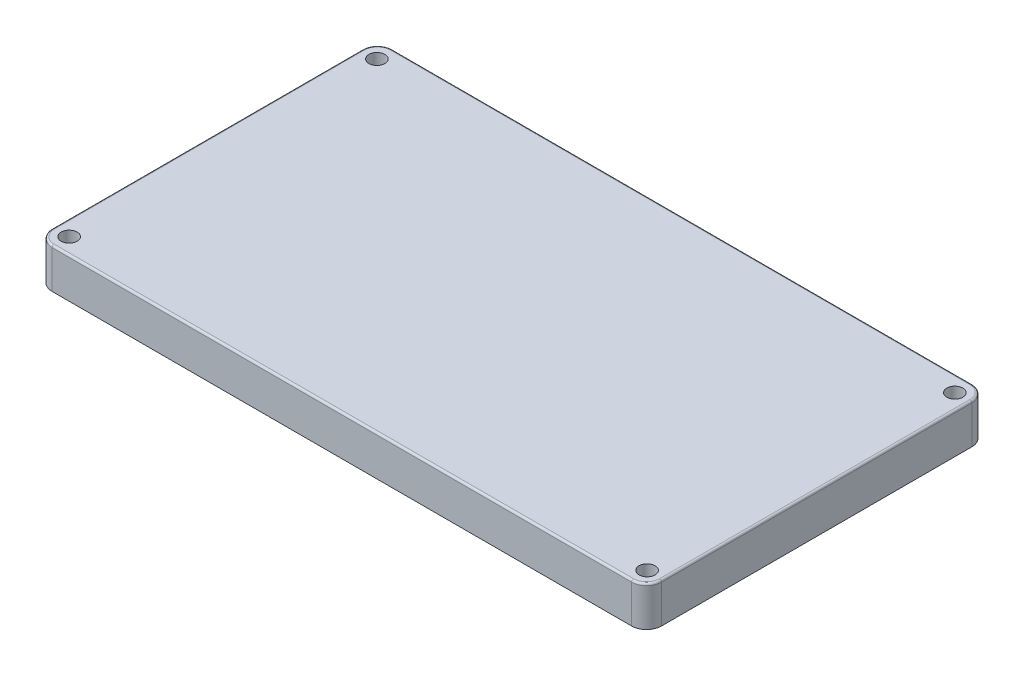
ISO-10303-21;
HEADER;
FILE_DESCRIPTION(('STEP AP214'),'2;1');
FILE_NAME('part.step','',(''),(''),'','','');
FILE_SCHEMA(('AUTOMOTIVE_DESIGN { 1 0 10303 214 1 1 1 1 }'));
ENDSEC;
DATA;
#1=APPLICATION_CONTEXT('core data for automotive mechanical design processes');
#2=APPLICATION_PROTOCOL_DEFINITION('international standard','automotive_design',2000,#1);
#3=PRODUCT_CONTEXT('',#1,'mechanical');
#4=PRODUCT('Part','Part','',(#3));
#5=PRODUCT_RELATED_PRODUCT_CATEGORY('part','',(#4));
#6=PRODUCT_DEFINITION_FORMATION('','',#4);
#7=PRODUCT_DEFINITION_CONTEXT('part definition',#1,'design');
#8=PRODUCT_DEFINITION('design','',#6,#7);
#9=PRODUCT_DEFINITION_SHAPE('','',#8);
#10=(LENGTH_UNIT() NAMED_UNIT(*) SI_UNIT(.MILLI.,.METRE.));
#11=(NAMED_UNIT(*) PLANE_ANGLE_UNIT() SI_UNIT($,.RADIAN.));
#12=(NAMED_UNIT(*) SI_UNIT($,.STERADIAN.) SOLID_ANGLE_UNIT());
#13=UNCERTAINTY_MEASURE_WITH_UNIT(LENGTH_MEASURE(1.E-05),#10,'distance_accuracy_value','');
#14=(GEOMETRIC_REPRESENTATION_CONTEXT(3) GLOBAL_UNCERTAINTY_ASSIGNED_CONTEXT((#13)) GLOBAL_UNIT_ASSIGNED_CONTEXT((#10,
#11,#12)) REPRESENTATION_CONTEXT('',''));
#15=CARTESIAN_POINT('',(0.,0.,0.));
#16=DIRECTION('',(0.,0.,1.));
#17=DIRECTION('',(1.,0.,0.));
#18=AXIS2_PLACEMENT_3D('',#15,#16,#17);
#19=CARTESIAN_POINT('',(0.,-82.5520685347959,-170.18));
#20=DIRECTION('',(-1.,0.,0.));
#21=DIRECTION('',(0.,0.,1.));
#22=AXIS2_PLACEMENT_3D('',#19,#20,#21);
#23=PLANE('',#22);
#24=DIRECTION('',(0.,1.,0.));
#25=VECTOR('',#24,1.);
#26=CARTESIAN_POINT('',(0.,-82.5520685347959,-7.50000000000001));
#27=LINE('',#26,#25);
#28=CARTESIAN_POINT('',(0.,-82.5520685347959,-7.50000000000001));
#29=VERTEX_POINT('',#28);
#30=CARTESIAN_POINT('',(0.,-63.5520685347959,-7.50000000000001));
#31=VERTEX_POINT('',#30);
#32=EDGE_CURVE('E174',#29,#31,#27,.T.);
#33=ORIENTED_EDGE('',*,*,#32,.T.);
#34=DIRECTION('',(0.,0.,1.));
#35=VECTOR('',#34,1.);
#36=CARTESIAN_POINT('',(0.,-63.5520685347959,-170.18));
#37=LINE('',#36,#35);
#38=CARTESIAN_POINT('',(0.,-63.5520685347959,-162.68));
#39=VERTEX_POINT('',#38);
#40=EDGE_CURVE('E210',#31,#39,#37,.F.);
#41=ORIENTED_EDGE('',*,*,#40,.T.);
#42=DIRECTION('',(0.,1.,0.));
#43=VECTOR('',#42,1.);
#44=CARTESIAN_POINT('',(0.,-82.5520685347959,-162.68));
#45=LINE('',#44,#43);
#46=CARTESIAN_POINT('',(0.,-82.5520685347959,-162.68));
#47=VERTEX_POINT('',#46);
#48=EDGE_CURVE('E178',#39,#47,#45,.F.);
#49=ORIENTED_EDGE('',*,*,#48,.T.);
#50=DIRECTION('',(0.,0.,1.));
#51=VECTOR('',#50,1.);
#52=CARTESIAN_POINT('',(0.,-82.5520685347959,-170.18));
#53=LINE('',#52,#51);
#54=EDGE_CURVE('E295',#47,#29,#53,.T.);
#55=ORIENTED_EDGE('',*,*,#54,.T.);
#56=EDGE_LOOP('',(#33,#41,#49,#55));
#57=FACE_BOUND('',#56,.T.);
#58=ADVANCED_FACE('F47',(#57),#23,.T.);
#59=CARTESIAN_POINT('',(304.8,-82.5520685347959,-170.18));
#60=DIRECTION('',(0.,0.,-1.));
#61=DIRECTION('',(-1.,0.,0.));
#62=AXIS2_PLACEMENT_3D('',#59,#60,#61);
#63=PLANE('',#62);
#64=DIRECTION('',(0.,1.,0.));
#65=VECTOR('',#64,1.);
#66=CARTESIAN_POINT('',(7.50000000000001,-82.5520685347959,-170.18));
#67=LINE('',#66,#65);
#68=CARTESIAN_POINT('',(7.50000000000012,-82.5520685347959,-170.18));
#69=VERTEX_POINT('',#68);
#70=CARTESIAN_POINT('',(7.50000000000001,-63.5520685347959,-170.18));
#71=VERTEX_POINT('',#70);
#72=EDGE_CURVE('E306',#69,#71,#67,.T.);
#73=ORIENTED_EDGE('',*,*,#72,.T.);
#74=DIRECTION('',(-1.,0.,0.));
#75=VECTOR('',#74,1.);
#76=CARTESIAN_POINT('',(304.8,-63.5520685347959,-170.18));
#77=LINE('',#76,#75);
#78=CARTESIAN_POINT('',(297.3,-63.5520685347959,-170.18));
#79=VERTEX_POINT('',#78);
#80=EDGE_CURVE('E213',#71,#79,#77,.F.);
#81=ORIENTED_EDGE('',*,*,#80,.T.);
#82=DIRECTION('',(0.,1.,0.));
#83=VECTOR('',#82,1.);
#84=CARTESIAN_POINT('',(297.3,-82.5520685347959,-170.18));
#85=LINE('',#84,#83);
#86=CARTESIAN_POINT('',(297.3,-82.5520685347959,-170.18));
#87=VERTEX_POINT('',#86);
#88=EDGE_CURVE('E310',#79,#87,#85,.F.);
#89=ORIENTED_EDGE('',*,*,#88,.T.);
#90=DIRECTION('',(-1.,0.,0.));
#91=VECTOR('',#90,1.);
#92=CARTESIAN_POINT('',(304.8,-82.5520685347959,-170.18));
#93=LINE('',#92,#91);
#94=EDGE_CURVE('E144',#87,#69,#93,.T.);
#95=ORIENTED_EDGE('',*,*,#94,.T.);
#96=EDGE_LOOP('',(#73,#81,#89,#95));
#97=FACE_BOUND('',#96,.T.);
#98=ADVANCED_FACE('F348',(#97),#63,.T.);
#99=CARTESIAN_POINT('',(304.8,-82.5520685347959,0.));
#100=DIRECTION('',(1.,0.,0.));
#101=DIRECTION('',(0.,0.,-1.));
#102=AXIS2_PLACEMENT_3D('',#99,#100,#101);
#103=PLANE('',#102);
#104=DIRECTION('',(0.,1.,0.));
#105=VECTOR('',#104,1.);
#106=CARTESIAN_POINT('',(304.8,-82.5520685347959,-162.68));
#107=LINE('',#106,#105);
#108=CARTESIAN_POINT('',(304.8,-82.5520685347959,-162.68));
#109=VERTEX_POINT('',#108);
#110=CARTESIAN_POINT('',(304.8,-63.5520685347959,-162.68));
#111=VERTEX_POINT('',#110);
#112=EDGE_CURVE('E143',#109,#111,#107,.T.);
#113=ORIENTED_EDGE('',*,*,#112,.T.);
#114=DIRECTION('',(0.,0.,-1.));
#115=VECTOR('',#114,1.);
#116=CARTESIAN_POINT('',(304.8,-63.5520685347959,0.));
#117=LINE('',#116,#115);
#118=CARTESIAN_POINT('',(304.8,-63.5520685347959,-7.5));
#119=VERTEX_POINT('',#118);
#120=EDGE_CURVE('E57',#111,#119,#117,.F.);
#121=ORIENTED_EDGE('',*,*,#120,.T.);
#122=DIRECTION('',(0.,1.,0.));
#123=VECTOR('',#122,1.);
#124=CARTESIAN_POINT('',(304.8,-82.5520685347959,-7.5));
#125=LINE('',#124,#123);
#126=CARTESIAN_POINT('',(304.8,-82.5520685347959,-7.5));
#127=VERTEX_POINT('',#126);
#128=EDGE_CURVE('E136',#119,#127,#125,.F.);
#129=ORIENTED_EDGE('',*,*,#128,.T.);
#130=DIRECTION('',(0.,0.,-1.));
#131=VECTOR('',#130,1.);
#132=CARTESIAN_POINT('',(304.8,-82.5520685347959,0.));
#133=LINE('',#132,#131);
#134=EDGE_CURVE('E139',#127,#109,#133,.T.);
#135=ORIENTED_EDGE('',*,*,#134,.T.);
#136=EDGE_LOOP('',(#113,#121,#129,#135));
#137=FACE_BOUND('',#136,.T.);
#138=ADVANCED_FACE('F138',(#137),#103,.T.);
#139=CARTESIAN_POINT('',(0.,-82.5520685347959,0.));
#140=DIRECTION('',(0.,0.,1.));
#141=DIRECTION('',(1.,0.,0.));
#142=AXIS2_PLACEMENT_3D('',#139,#140,#141);
#143=PLANE('',#142);
#144=DIRECTION('',(0.,1.,0.));
#145=VECTOR('',#144,1.);
#146=CARTESIAN_POINT('',(297.3,-82.5520685347959,0.));
#147=LINE('',#146,#145);
#148=CARTESIAN_POINT('',(297.3,-82.5520685347959,0.));
#149=VERTEX_POINT('',#148);
#150=CARTESIAN_POINT('',(297.3,-63.5520685347959,0.));
#151=VERTEX_POINT('',#150);
#152=EDGE_CURVE('E158',#149,#151,#147,.T.);
#153=ORIENTED_EDGE('',*,*,#152,.T.);
#154=DIRECTION('',(1.,0.,0.));
#155=VECTOR('',#154,1.);
#156=CARTESIAN_POINT('',(0.,-63.5520685347959,0.));
#157=LINE('',#156,#155);
#158=CARTESIAN_POINT('',(7.5,-63.5520685347959,0.));
#159=VERTEX_POINT('',#158);
#160=EDGE_CURVE('E222',#151,#159,#157,.F.);
#161=ORIENTED_EDGE('',*,*,#160,.T.);
#162=DIRECTION('',(0.,1.,0.));
#163=VECTOR('',#162,1.);
#164=CARTESIAN_POINT('',(7.5,-82.5520685347959,0.));
#165=LINE('',#164,#163);
#166=CARTESIAN_POINT('',(7.5,-82.5520685347959,0.));
#167=VERTEX_POINT('',#166);
#168=EDGE_CURVE('E164',#159,#167,#165,.F.);
#169=ORIENTED_EDGE('',*,*,#168,.T.);
#170=DIRECTION('',(1.,0.,0.));
#171=VECTOR('',#170,1.);
#172=CARTESIAN_POINT('',(0.,-82.5520685347959,0.));
#173=LINE('',#172,#171);
#174=EDGE_CURVE('E155',#167,#149,#173,.T.);
#175=ORIENTED_EDGE('',*,*,#174,.T.);
#176=EDGE_LOOP('',(#153,#161,#169,#175));
#177=FACE_BOUND('',#176,.T.);
#178=ADVANCED_FACE('F364',(#177),#143,.T.);
#179=CARTESIAN_POINT('',(0.,-82.5520685347959,0.));
#180=DIRECTION('',(0.,1.,0.));
#181=DIRECTION('',(0.,0.,1.));
#182=AXIS2_PLACEMENT_3D('',#179,#180,#181);
#183=PLANE('',#182);
#184=CARTESIAN_POINT('',(7.99999999999998,-82.5520685347959,-8.00000000000009));
#185=DIRECTION('',(0.,1.,0.));
#186=DIRECTION('',(0.,0.,1.));
#187=AXIS2_PLACEMENT_3D('',#184,#185,#186);
#188=CIRCLE('',#187,4.00000000000001);
#189=CARTESIAN_POINT('',(7.99999999999998,-82.5520685347959,-4.00000000000008));
#190=VERTEX_POINT('',#189);
#191=EDGE_CURVE('E263',#190,#190,#188,.T.);
#192=ORIENTED_EDGE('',*,*,#191,.T.);
#193=EDGE_LOOP('',(#192));
#194=FACE_BOUND('',#193,.T.);
#195=CARTESIAN_POINT('',(297.052,-82.5520685347959,-8.00000000000009));
#196=DIRECTION('',(0.,1.,0.));
#197=DIRECTION('',(0.,0.,1.));
#198=AXIS2_PLACEMENT_3D('',#195,#196,#197);
#199=CIRCLE('',#198,4.);
#200=CARTESIAN_POINT('',(297.052,-82.5520685347959,-4.00000000000009));
#201=VERTEX_POINT('',#200);
#202=EDGE_CURVE('E275',#201,#201,#199,.T.);
#203=ORIENTED_EDGE('',*,*,#202,.T.);
#204=EDGE_LOOP('',(#203));
#205=FACE_BOUND('',#204,.T.);
#206=CARTESIAN_POINT('',(7.99999999999998,-82.5520685347959,-161.924));
#207=DIRECTION('',(0.,1.,0.));
#208=DIRECTION('',(0.,0.,1.));
#209=AXIS2_PLACEMENT_3D('',#206,#207,#208);
#210=CIRCLE('',#209,4.00000000000001);
#211=CARTESIAN_POINT('',(7.99999999999998,-82.5520685347959,-157.924));
#212=VERTEX_POINT('',#211);
#213=EDGE_CURVE('E283',#212,#212,#210,.T.);
#214=ORIENTED_EDGE('',*,*,#213,.T.);
#215=EDGE_LOOP('',(#214));
#216=FACE_BOUND('',#215,.T.);
#217=CARTESIAN_POINT('',(297.052,-82.5520685347959,-161.924));
#218=DIRECTION('',(0.,1.,0.));
#219=DIRECTION('',(0.,0.,1.));
#220=AXIS2_PLACEMENT_3D('',#217,#218,#219);
#221=CIRCLE('',#220,4.);
#222=CARTESIAN_POINT('',(297.052,-82.5520685347959,-157.924));
#223=VERTEX_POINT('',#222);
#224=EDGE_CURVE('E291',#223,#223,#221,.T.);
#225=ORIENTED_EDGE('',*,*,#224,.T.);
#226=EDGE_LOOP('',(#225));
#227=FACE_BOUND('',#226,.T.);
#228=ORIENTED_EDGE('',*,*,#94,.F.);
#229=CARTESIAN_POINT('',(297.3,-82.5520685347959,-162.68));
#230=DIRECTION('',(0.,1.,0.));
#231=DIRECTION('',(0.,0.,1.));
#232=AXIS2_PLACEMENT_3D('',#229,#230,#231);
#233=CIRCLE('',#232,7.5);
#234=EDGE_CURVE('E153',#87,#109,#233,.F.);
#235=ORIENTED_EDGE('',*,*,#234,.T.);
#236=ORIENTED_EDGE('',*,*,#134,.F.);
#237=CARTESIAN_POINT('',(297.3,-82.5520685347959,-7.5));
#238=DIRECTION('',(0.,1.,0.));
#239=DIRECTION('',(0.,0.,1.));
#240=AXIS2_PLACEMENT_3D('',#237,#238,#239);
#241=CIRCLE('',#240,7.5);
#242=EDGE_CURVE('E150',#127,#149,#241,.F.);
#243=ORIENTED_EDGE('',*,*,#242,.T.);
#244=ORIENTED_EDGE('',*,*,#174,.F.);
#245=CARTESIAN_POINT('',(7.5,-82.5520685347959,-7.50000000000001));
#246=DIRECTION('',(0.,1.,0.));
#247=DIRECTION('',(0.,0.,1.));
#248=AXIS2_PLACEMENT_3D('',#245,#246,#247);
#249=CIRCLE('',#248,7.5);
#250=EDGE_CURVE('E166',#167,#29,#249,.F.);
#251=ORIENTED_EDGE('',*,*,#250,.T.);
#252=ORIENTED_EDGE('',*,*,#54,.F.);
#253=CARTESIAN_POINT('',(7.50000000000001,-82.5520685347959,-162.68));
#254=DIRECTION('',(0.,1.,0.));
#255=DIRECTION('',(0.,0.,1.));
#256=AXIS2_PLACEMENT_3D('',#253,#254,#255);
#257=CIRCLE('',#256,7.5);
#258=EDGE_CURVE('E160',#47,#69,#257,.F.);
#259=ORIENTED_EDGE('',*,*,#258,.T.);
#260=EDGE_LOOP('',(#228,#235,#236,#243,#244,#251,#252,#259));
#261=FACE_BOUND('',#260,.T.);
#262=ADVANCED_FACE('F148',(#194,#205,#216,#227,#261),#183,.F.);
#263=CARTESIAN_POINT('',(0.,-62.5520685347959,0.));
#264=DIRECTION('',(0.,1.,0.));
#265=DIRECTION('',(0.,0.,1.));
#266=AXIS2_PLACEMENT_3D('',#263,#264,#265);
#267=PLANE('',#266);
#268=DIRECTION('',(-1.,0.,0.));
#269=VECTOR('',#268,1.);
#270=CARTESIAN_POINT('',(0.,-62.5520685347959,-169.18));
#271=LINE('',#270,#269);
#272=CARTESIAN_POINT('',(297.3,-62.5520685347959,-169.18));
#273=VERTEX_POINT('',#272);
#274=CARTESIAN_POINT('',(7.50000000000001,-62.5520685347959,-169.18));
#275=VERTEX_POINT('',#274);
#276=EDGE_CURVE('E196',#273,#275,#271,.T.);
#277=ORIENTED_EDGE('',*,*,#276,.T.);
#278=CARTESIAN_POINT('',(7.50000000000001,-62.5520685347959,-162.68));
#279=DIRECTION('',(0.,1.,0.));
#280=DIRECTION('',(0.,0.,1.));
#281=AXIS2_PLACEMENT_3D('',#278,#279,#280);
#282=CIRCLE('',#281,6.5);
#283=CARTESIAN_POINT('',(0.999999999999999,-62.5520685347959,-162.68));
#284=VERTEX_POINT('',#283);
#285=EDGE_CURVE('E202',#275,#284,#282,.T.);
#286=ORIENTED_EDGE('',*,*,#285,.T.);
#287=DIRECTION('',(0.,0.,1.));
#288=VECTOR('',#287,1.);
#289=CARTESIAN_POINT('',(0.999999999999999,-62.5520685347959,0.));
#290=LINE('',#289,#288);
#291=CARTESIAN_POINT('',(0.999999999999999,-62.5520685347959,-7.50000000000001));
#292=VERTEX_POINT('',#291);
#293=EDGE_CURVE('E199',#284,#292,#290,.T.);
#294=ORIENTED_EDGE('',*,*,#293,.T.);
#295=CARTESIAN_POINT('',(7.5,-62.5520685347959,-7.50000000000001));
#296=DIRECTION('',(0.,1.,0.));
#297=DIRECTION('',(0.,0.,1.));
#298=AXIS2_PLACEMENT_3D('',#295,#296,#297);
#299=CIRCLE('',#298,6.5);
#300=CARTESIAN_POINT('',(7.5,-62.5520685347959,-0.999999999999999));
#301=VERTEX_POINT('',#300);
#302=EDGE_CURVE('E193',#292,#301,#299,.T.);
#303=ORIENTED_EDGE('',*,*,#302,.T.);
#304=DIRECTION('',(1.,0.,0.));
#305=VECTOR('',#304,1.);
#306=CARTESIAN_POINT('',(0.,-62.5520685347959,-0.999999999999999));
#307=LINE('',#306,#305);
#308=CARTESIAN_POINT('',(297.3,-62.5520685347959,-0.999999999999999));
#309=VERTEX_POINT('',#308);
#310=EDGE_CURVE('E187',#301,#309,#307,.T.);
#311=ORIENTED_EDGE('',*,*,#310,.T.);
#312=CARTESIAN_POINT('',(297.3,-62.5520685347959,-7.5));
#313=DIRECTION('',(0.,1.,0.));
#314=DIRECTION('',(0.,0.,1.));
#315=AXIS2_PLACEMENT_3D('',#312,#313,#314);
#316=CIRCLE('',#315,6.5);
#317=CARTESIAN_POINT('',(303.8,-62.5520685347959,-7.5));
#318=VERTEX_POINT('',#317);
#319=EDGE_CURVE('E181',#309,#318,#316,.T.);
#320=ORIENTED_EDGE('',*,*,#319,.T.);
#321=DIRECTION('',(0.,0.,-1.));
#322=VECTOR('',#321,1.);
#323=CARTESIAN_POINT('',(303.8,-62.5520685347959,0.));
#324=LINE('',#323,#322);
#325=CARTESIAN_POINT('',(303.8,-62.5520685347959,-162.68));
#326=VERTEX_POINT('',#325);
#327=EDGE_CURVE('E184',#318,#326,#324,.T.);
#328=ORIENTED_EDGE('',*,*,#327,.T.);
#329=CARTESIAN_POINT('',(297.3,-62.5520685347959,-162.68));
#330=DIRECTION('',(0.,1.,0.));
#331=DIRECTION('',(0.,0.,1.));
#332=AXIS2_PLACEMENT_3D('',#329,#330,#331);
#333=CIRCLE('',#332,6.5);
#334=EDGE_CURVE('E190',#326,#273,#333,.T.);
#335=ORIENTED_EDGE('',*,*,#334,.T.);
#336=EDGE_LOOP('',(#277,#286,#294,#303,#311,#320,#328,#335));
#337=FACE_BOUND('',#336,.T.);
#338=CARTESIAN_POINT('',(7.99999999999998,-62.5520685347959,-8.00000000000009));
#339=DIRECTION('',(0.,1.,0.));
#340=DIRECTION('',(0.,0.,1.));
#341=AXIS2_PLACEMENT_3D('',#338,#339,#340);
#342=CIRCLE('',#341,4.00000000000001);
#343=CARTESIAN_POINT('',(7.99999999999998,-62.5520685347959,-4.00000000000008));
#344=VERTEX_POINT('',#343);
#345=EDGE_CURVE('E257',#344,#344,#342,.T.);
#346=ORIENTED_EDGE('',*,*,#345,.F.);
#347=EDGE_LOOP('',(#346));
#348=FACE_BOUND('',#347,.T.);
#349=CARTESIAN_POINT('',(297.052,-62.5520685347959,-8.00000000000009));
#350=DIRECTION('',(0.,1.,0.));
#351=DIRECTION('',(0.,0.,1.));
#352=AXIS2_PLACEMENT_3D('',#349,#350,#351);
#353=CIRCLE('',#352,4.);
#354=CARTESIAN_POINT('',(297.052,-62.5520685347959,-4.00000000000009));
#355=VERTEX_POINT('',#354);
#356=EDGE_CURVE('E269',#355,#355,#353,.T.);
#357=ORIENTED_EDGE('',*,*,#356,.F.);
#358=EDGE_LOOP('',(#357));
#359=FACE_BOUND('',#358,.T.);
#360=CARTESIAN_POINT('',(7.99999999999998,-62.5520685347959,-161.924));
#361=DIRECTION('',(0.,1.,0.));
#362=DIRECTION('',(0.,0.,1.));
#363=AXIS2_PLACEMENT_3D('',#360,#361,#362);
#364=CIRCLE('',#363,4.00000000000001);
#365=CARTESIAN_POINT('',(7.99999999999998,-62.5520685347959,-157.924));
#366=VERTEX_POINT('',#365);
#367=EDGE_CURVE('E279',#366,#366,#364,.T.);
#368=ORIENTED_EDGE('',*,*,#367,.F.);
#369=EDGE_LOOP('',(#368));
#370=FACE_BOUND('',#369,.T.);
#371=CARTESIAN_POINT('',(297.052,-62.5520685347959,-161.924));
#372=DIRECTION('',(0.,1.,0.));
#373=DIRECTION('',(0.,0.,1.));
#374=AXIS2_PLACEMENT_3D('',#371,#372,#373);
#375=CIRCLE('',#374,4.);
#376=CARTESIAN_POINT('',(297.052,-62.5520685347959,-157.924));
#377=VERTEX_POINT('',#376);
#378=EDGE_CURVE('E287',#377,#377,#375,.T.);
#379=ORIENTED_EDGE('',*,*,#378,.F.);
#380=EDGE_LOOP('',(#379));
#381=FACE_BOUND('',#380,.T.);
#382=ADVANCED_FACE('F358',(#337,#348,#359,#370,#381),#267,.T.);
#383=CARTESIAN_POINT('',(297.052,-62.5520685347959,-161.924));
#384=DIRECTION('',(0.,1.,0.));
#385=DIRECTION('',(0.,0.,1.));
#386=AXIS2_PLACEMENT_3D('',#383,#384,#385);
#387=CYLINDRICAL_SURFACE('',#386,4.);
#388=ORIENTED_EDGE('',*,*,#224,.F.);
#389=EDGE_LOOP('',(#388));
#390=FACE_BOUND('',#389,.T.);
#391=ORIENTED_EDGE('',*,*,#378,.T.);
#392=EDGE_LOOP('',(#391));
#393=FACE_BOUND('',#392,.T.);
#394=ADVANCED_FACE('F448',(#390,#393),#387,.F.);
#395=CARTESIAN_POINT('',(7.99999999999998,-62.5520685347959,-161.924));
#396=DIRECTION('',(0.,1.,0.));
#397=DIRECTION('',(0.,0.,1.));
#398=AXIS2_PLACEMENT_3D('',#395,#396,#397);
#399=CYLINDRICAL_SURFACE('',#398,4.00000000000001);
#400=ORIENTED_EDGE('',*,*,#213,.F.);
#401=EDGE_LOOP('',(#400));
#402=FACE_BOUND('',#401,.T.);
#403=ORIENTED_EDGE('',*,*,#367,.T.);
#404=EDGE_LOOP('',(#403));
#405=FACE_BOUND('',#404,.T.);
#406=ADVANCED_FACE('F440',(#402,#405),#399,.F.);
#407=CARTESIAN_POINT('',(297.052,-62.5520685347959,-8.00000000000009));
#408=DIRECTION('',(0.,1.,0.));
#409=DIRECTION('',(0.,0.,1.));
#410=AXIS2_PLACEMENT_3D('',#407,#408,#409);
#411=CYLINDRICAL_SURFACE('',#410,4.);
#412=ORIENTED_EDGE('',*,*,#202,.F.);
#413=EDGE_LOOP('',(#412));
#414=FACE_BOUND('',#413,.T.);
#415=ORIENTED_EDGE('',*,*,#356,.T.);
#416=EDGE_LOOP('',(#415));
#417=FACE_BOUND('',#416,.T.);
#418=ADVANCED_FACE('F431',(#414,#417),#411,.F.);
#419=CARTESIAN_POINT('',(7.99999999999998,-62.5520685347959,-8.00000000000009));
#420=DIRECTION('',(0.,1.,0.));
#421=DIRECTION('',(0.,0.,1.));
#422=AXIS2_PLACEMENT_3D('',#419,#420,#421);
#423=CYLINDRICAL_SURFACE('',#422,4.00000000000001);
#424=ORIENTED_EDGE('',*,*,#191,.F.);
#425=EDGE_LOOP('',(#424));
#426=FACE_BOUND('',#425,.T.);
#427=ORIENTED_EDGE('',*,*,#345,.T.);
#428=EDGE_LOOP('',(#427));
#429=FACE_BOUND('',#428,.T.);
#430=ADVANCED_FACE('F383',(#426,#429),#423,.F.);
#431=CARTESIAN_POINT('',(297.3,-82.5520685347959,-162.68));
#432=DIRECTION('',(0.,1.,0.));
#433=DIRECTION('',(0.,0.,1.));
#434=AXIS2_PLACEMENT_3D('',#431,#432,#433);
#435=CYLINDRICAL_SURFACE('',#434,7.5);
#436=ORIENTED_EDGE('',*,*,#88,.F.);
#437=CARTESIAN_POINT('',(297.3,-63.5520685347959,-162.68));
#438=DIRECTION('',(0.,1.,0.));
#439=DIRECTION('',(0.,0.,1.));
#440=AXIS2_PLACEMENT_3D('',#437,#438,#439);
#441=CIRCLE('',#440,7.5);
#442=EDGE_CURVE('E219',#79,#111,#441,.F.);
#443=ORIENTED_EDGE('',*,*,#442,.T.);
#444=ORIENTED_EDGE('',*,*,#112,.F.);
#445=ORIENTED_EDGE('',*,*,#234,.F.);
#446=EDGE_LOOP('',(#436,#443,#444,#445));
#447=FACE_BOUND('',#446,.T.);
#448=ADVANCED_FACE('F351',(#447),#435,.T.);
#449=CARTESIAN_POINT('',(297.3,-82.5520685347959,-7.5));
#450=DIRECTION('',(0.,1.,0.));
#451=DIRECTION('',(0.,0.,1.));
#452=AXIS2_PLACEMENT_3D('',#449,#450,#451);
#453=CYLINDRICAL_SURFACE('',#452,7.5);
#454=ORIENTED_EDGE('',*,*,#128,.F.);
#455=CARTESIAN_POINT('',(297.3,-63.5520685347959,-7.5));
#456=DIRECTION('',(0.,1.,0.));
#457=DIRECTION('',(0.,0.,1.));
#458=AXIS2_PLACEMENT_3D('',#455,#456,#457);
#459=CIRCLE('',#458,7.5);
#460=EDGE_CURVE('E11',#119,#151,#459,.F.);
#461=ORIENTED_EDGE('',*,*,#460,.T.);
#462=ORIENTED_EDGE('',*,*,#152,.F.);
#463=ORIENTED_EDGE('',*,*,#242,.F.);
#464=EDGE_LOOP('',(#454,#461,#462,#463));
#465=FACE_BOUND('',#464,.T.);
#466=ADVANCED_FACE('F157',(#465),#453,.T.);
#467=CARTESIAN_POINT('',(7.50000000000001,-82.5520685347959,-162.68));
#468=DIRECTION('',(0.,1.,0.));
#469=DIRECTION('',(0.,0.,1.));
#470=AXIS2_PLACEMENT_3D('',#467,#468,#469);
#471=CYLINDRICAL_SURFACE('',#470,7.5);
#472=ORIENTED_EDGE('',*,*,#48,.F.);
#473=CARTESIAN_POINT('',(7.50000000000001,-63.5520685347959,-162.68));
#474=DIRECTION('',(0.,1.,0.));
#475=DIRECTION('',(0.,0.,1.));
#476=AXIS2_PLACEMENT_3D('',#473,#474,#475);
#477=CIRCLE('',#476,7.5);
#478=EDGE_CURVE('E206',#39,#71,#477,.F.);
#479=ORIENTED_EDGE('',*,*,#478,.T.);
#480=ORIENTED_EDGE('',*,*,#72,.F.);
#481=ORIENTED_EDGE('',*,*,#258,.F.);
#482=EDGE_LOOP('',(#472,#479,#480,#481));
#483=FACE_BOUND('',#482,.T.);
#484=ADVANCED_FACE('F335',(#483),#471,.T.);
#485=CARTESIAN_POINT('',(7.5,-82.5520685347959,-7.50000000000001));
#486=DIRECTION('',(0.,1.,0.));
#487=DIRECTION('',(0.,0.,1.));
#488=AXIS2_PLACEMENT_3D('',#485,#486,#487);
#489=CYLINDRICAL_SURFACE('',#488,7.5);
#490=ORIENTED_EDGE('',*,*,#168,.F.);
#491=CARTESIAN_POINT('',(7.5,-63.5520685347959,-7.50000000000001));
#492=DIRECTION('',(0.,1.,0.));
#493=DIRECTION('',(0.,0.,1.));
#494=AXIS2_PLACEMENT_3D('',#491,#492,#493);
#495=CIRCLE('',#494,7.5);
#496=EDGE_CURVE('E216',#159,#31,#495,.F.);
#497=ORIENTED_EDGE('',*,*,#496,.T.);
#498=ORIENTED_EDGE('',*,*,#32,.F.);
#499=ORIENTED_EDGE('',*,*,#250,.F.);
#500=EDGE_LOOP('',(#490,#497,#498,#499));
#501=FACE_BOUND('',#500,.T.);
#502=ADVANCED_FACE('F322',(#501),#489,.T.);
#503=CARTESIAN_POINT('',(297.3,-63.5520685347959,-7.5));
#504=DIRECTION('',(0.,1.,0.));
#505=DIRECTION('',(0.,0.,1.));
#506=AXIS2_PLACEMENT_3D('',#503,#504,#505);
#507=TOROIDAL_SURFACE('',#506,6.5,0.999999999999999);
#508=CARTESIAN_POINT('',(297.3,-63.5520685347959,-0.999999999999999));
#509=DIRECTION('',(-1.,0.,0.));
#510=DIRECTION('',(0.,0.,1.));
#511=AXIS2_PLACEMENT_3D('',#508,#509,#510);
#512=CIRCLE('',#511,0.999999999999999);
#513=EDGE_CURVE('E248',#151,#309,#512,.T.);
#514=ORIENTED_EDGE('',*,*,#513,.F.);
#515=ORIENTED_EDGE('',*,*,#460,.F.);
#516=CARTESIAN_POINT('',(303.8,-63.5520685347959,-7.5));
#517=DIRECTION('',(0.,0.,-1.));
#518=DIRECTION('',(-1.,0.,0.));
#519=AXIS2_PLACEMENT_3D('',#516,#517,#518);
#520=CIRCLE('',#519,0.999999999999999);
#521=EDGE_CURVE('E51',#318,#119,#520,.T.);
#522=ORIENTED_EDGE('',*,*,#521,.F.);
#523=ORIENTED_EDGE('',*,*,#319,.F.);
#524=EDGE_LOOP('',(#514,#515,#522,#523));
#525=FACE_BOUND('',#524,.T.);
#526=ADVANCED_FACE('F49',(#525),#507,.T.);
#527=CARTESIAN_POINT('',(303.8,-63.5520685347959,0.));
#528=DIRECTION('',(0.,0.,-1.));
#529=DIRECTION('',(-1.,0.,0.));
#530=AXIS2_PLACEMENT_3D('',#527,#528,#529);
#531=CYLINDRICAL_SURFACE('',#530,0.999999999999999);
#532=ORIENTED_EDGE('',*,*,#521,.T.);
#533=ORIENTED_EDGE('',*,*,#120,.F.);
#534=CARTESIAN_POINT('',(303.8,-63.5520685347959,-162.68));
#535=DIRECTION('',(0.,0.,-1.));
#536=DIRECTION('',(-1.,0.,0.));
#537=AXIS2_PLACEMENT_3D('',#534,#535,#536);
#538=CIRCLE('',#537,0.999999999999999);
#539=EDGE_CURVE('E245',#326,#111,#538,.T.);
#540=ORIENTED_EDGE('',*,*,#539,.F.);
#541=ORIENTED_EDGE('',*,*,#327,.F.);
#542=EDGE_LOOP('',(#532,#533,#540,#541));
#543=FACE_BOUND('',#542,.T.);
#544=ADVANCED_FACE('F356',(#543),#531,.T.);
#545=CARTESIAN_POINT('',(0.,-63.5520685347959,-0.999999999999999));
#546=DIRECTION('',(1.,0.,0.));
#547=DIRECTION('',(0.,0.,-1.));
#548=AXIS2_PLACEMENT_3D('',#545,#546,#547);
#549=CYLINDRICAL_SURFACE('',#548,0.999999999999999);
#550=ORIENTED_EDGE('',*,*,#513,.T.);
#551=ORIENTED_EDGE('',*,*,#310,.F.);
#552=CARTESIAN_POINT('',(7.5,-63.5520685347959,-0.999999999999999));
#553=DIRECTION('',(-1.,0.,0.));
#554=DIRECTION('',(0.,0.,1.));
#555=AXIS2_PLACEMENT_3D('',#552,#553,#554);
#556=CIRCLE('',#555,0.999999999999999);
#557=EDGE_CURVE('E241',#159,#301,#556,.T.);
#558=ORIENTED_EDGE('',*,*,#557,.F.);
#559=ORIENTED_EDGE('',*,*,#160,.F.);
#560=EDGE_LOOP('',(#550,#551,#558,#559));
#561=FACE_BOUND('',#560,.T.);
#562=ADVANCED_FACE('F362',(#561),#549,.T.);
#563=CARTESIAN_POINT('',(297.3,-63.5520685347959,-162.68));
#564=DIRECTION('',(0.,1.,0.));
#565=DIRECTION('',(0.,0.,1.));
#566=AXIS2_PLACEMENT_3D('',#563,#564,#565);
#567=TOROIDAL_SURFACE('',#566,6.5,0.999999999999999);
#568=ORIENTED_EDGE('',*,*,#539,.T.);
#569=ORIENTED_EDGE('',*,*,#442,.F.);
#570=CARTESIAN_POINT('',(297.3,-63.5520685347959,-169.18));
#571=DIRECTION('',(-1.,0.,0.));
#572=DIRECTION('',(0.,0.,1.));
#573=AXIS2_PLACEMENT_3D('',#570,#571,#572);
#574=CIRCLE('',#573,0.999999999999999);
#575=EDGE_CURVE('E237',#273,#79,#574,.T.);
#576=ORIENTED_EDGE('',*,*,#575,.F.);
#577=ORIENTED_EDGE('',*,*,#334,.F.);
#578=EDGE_LOOP('',(#568,#569,#576,#577));
#579=FACE_BOUND('',#578,.T.);
#580=ADVANCED_FACE('F353',(#579),#567,.T.);
#581=CARTESIAN_POINT('',(7.5,-63.5520685347959,-7.50000000000001));
#582=DIRECTION('',(0.,1.,0.));
#583=DIRECTION('',(0.,0.,1.));
#584=AXIS2_PLACEMENT_3D('',#581,#582,#583);
#585=TOROIDAL_SURFACE('',#584,6.5,0.999999999999999);
#586=ORIENTED_EDGE('',*,*,#557,.T.);
#587=ORIENTED_EDGE('',*,*,#302,.F.);
#588=CARTESIAN_POINT('',(0.999999999999999,-63.5520685347959,-7.50000000000001));
#589=DIRECTION('',(0.,0.,-1.));
#590=DIRECTION('',(-1.,0.,0.));
#591=AXIS2_PLACEMENT_3D('',#588,#589,#590);
#592=CIRCLE('',#591,0.999999999999999);
#593=EDGE_CURVE('E233',#31,#292,#592,.T.);
#594=ORIENTED_EDGE('',*,*,#593,.F.);
#595=ORIENTED_EDGE('',*,*,#496,.F.);
#596=EDGE_LOOP('',(#586,#587,#594,#595));
#597=FACE_BOUND('',#596,.T.);
#598=ADVANCED_FACE('F326',(#597),#585,.T.);
#599=CARTESIAN_POINT('',(0.,-63.5520685347959,-169.18));
#600=DIRECTION('',(-1.,0.,0.));
#601=DIRECTION('',(0.,0.,1.));
#602=AXIS2_PLACEMENT_3D('',#599,#600,#601);
#603=CYLINDRICAL_SURFACE('',#602,0.999999999999999);
#604=ORIENTED_EDGE('',*,*,#575,.T.);
#605=ORIENTED_EDGE('',*,*,#80,.F.);
#606=CARTESIAN_POINT('',(7.50000000000001,-63.5520685347959,-169.18));
#607=DIRECTION('',(-1.,0.,0.));
#608=DIRECTION('',(0.,0.,1.));
#609=AXIS2_PLACEMENT_3D('',#606,#607,#608);
#610=CIRCLE('',#609,0.999999999999999);
#611=EDGE_CURVE('E230',#275,#71,#610,.T.);
#612=ORIENTED_EDGE('',*,*,#611,.F.);
#613=ORIENTED_EDGE('',*,*,#276,.F.);
#614=EDGE_LOOP('',(#604,#605,#612,#613));
#615=FACE_BOUND('',#614,.T.);
#616=ADVANCED_FACE('F344',(#615),#603,.T.);
#617=CARTESIAN_POINT('',(0.999999999999999,-63.5520685347959,0.));
#618=DIRECTION('',(0.,0.,1.));
#619=DIRECTION('',(1.,0.,0.));
#620=AXIS2_PLACEMENT_3D('',#617,#618,#619);
#621=CYLINDRICAL_SURFACE('',#620,0.999999999999999);
#622=ORIENTED_EDGE('',*,*,#593,.T.);
#623=ORIENTED_EDGE('',*,*,#293,.F.);
#624=CARTESIAN_POINT('',(0.999999999999999,-63.5520685347959,-162.68));
#625=DIRECTION('',(0.,0.,-1.));
#626=DIRECTION('',(-1.,0.,0.));
#627=AXIS2_PLACEMENT_3D('',#624,#625,#626);
#628=CIRCLE('',#627,0.999999999999999);
#629=EDGE_CURVE('E227',#39,#284,#628,.T.);
#630=ORIENTED_EDGE('',*,*,#629,.F.);
#631=ORIENTED_EDGE('',*,*,#40,.F.);
#632=EDGE_LOOP('',(#622,#623,#630,#631));
#633=FACE_BOUND('',#632,.T.);
#634=ADVANCED_FACE('F332',(#633),#621,.T.);
#635=CARTESIAN_POINT('',(7.50000000000001,-63.5520685347959,-162.68));
#636=DIRECTION('',(0.,1.,0.));
#637=DIRECTION('',(0.,0.,1.));
#638=AXIS2_PLACEMENT_3D('',#635,#636,#637);
#639=TOROIDAL_SURFACE('',#638,6.5,0.999999999999999);
#640=ORIENTED_EDGE('',*,*,#611,.T.);
#641=ORIENTED_EDGE('',*,*,#478,.F.);
#642=ORIENTED_EDGE('',*,*,#629,.T.);
#643=ORIENTED_EDGE('',*,*,#285,.F.);
#644=EDGE_LOOP('',(#640,#641,#642,#643));
#645=FACE_BOUND('',#644,.T.);
#646=ADVANCED_FACE('F338',(#645),#639,.T.);
#647=CLOSED_SHELL('',(#58,#98,#138,#178,#262,#382,#394,#406,#418,#430,#448,#466,#484,#502,#526,
#544,#562,#580,#598,#616,#634,#646));
#648=MANIFOLD_SOLID_BREP('B2',#647);
#649=ADVANCED_BREP_SHAPE_REPRESENTATION('',(#18,#648),#14);
#650=SHAPE_DEFINITION_REPRESENTATION(#9,#649);
ENDSEC;
END-ISO-10303-21;
